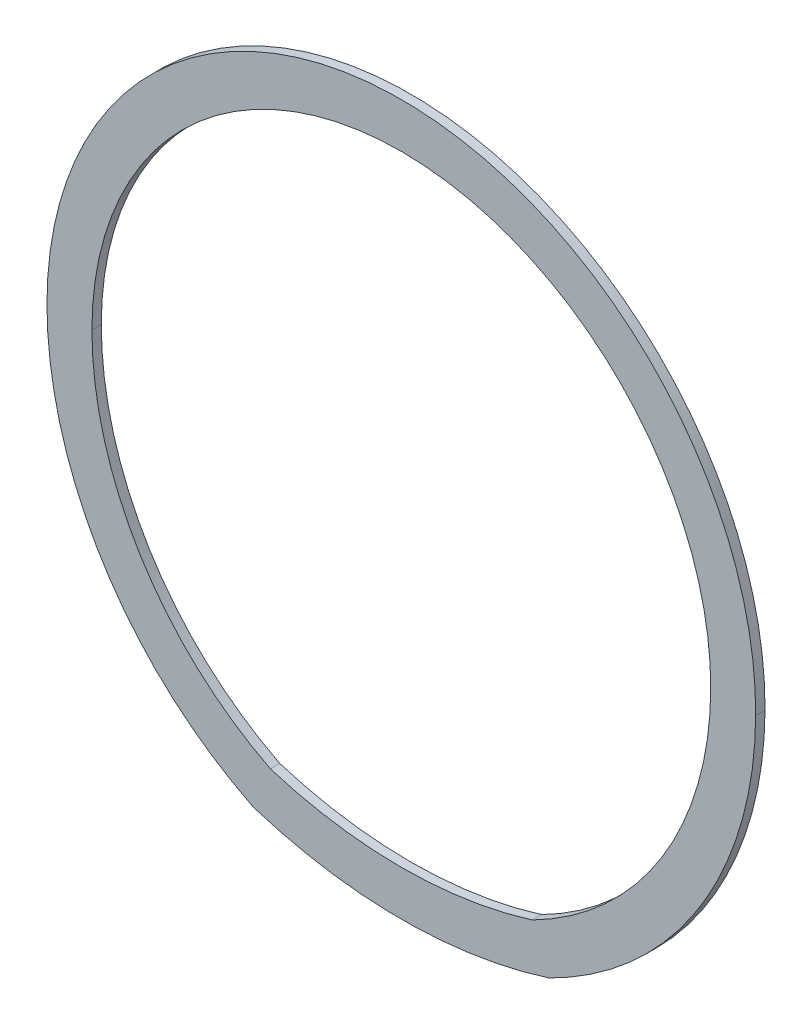
ISO-10303-21;
HEADER;
FILE_DESCRIPTION(('STEP AP214'),'2;1');
FILE_NAME('part.step','',(''),(''),'','','');
FILE_SCHEMA(('AUTOMOTIVE_DESIGN { 1 0 10303 214 1 1 1 1 }'));
ENDSEC;
DATA;
#1=APPLICATION_CONTEXT('core data for automotive mechanical design processes');
#2=APPLICATION_PROTOCOL_DEFINITION('international standard','automotive_design',2000,#1);
#3=PRODUCT_CONTEXT('',#1,'mechanical');
#4=PRODUCT('Part','Part','',(#3));
#5=PRODUCT_RELATED_PRODUCT_CATEGORY('part','',(#4));
#6=PRODUCT_DEFINITION_FORMATION('','',#4);
#7=PRODUCT_DEFINITION_CONTEXT('part definition',#1,'design');
#8=PRODUCT_DEFINITION('design','',#6,#7);
#9=PRODUCT_DEFINITION_SHAPE('','',#8);
#10=(LENGTH_UNIT() NAMED_UNIT(*) SI_UNIT(.MILLI.,.METRE.));
#11=(NAMED_UNIT(*) PLANE_ANGLE_UNIT() SI_UNIT($,.RADIAN.));
#12=(NAMED_UNIT(*) SI_UNIT($,.STERADIAN.) SOLID_ANGLE_UNIT());
#13=UNCERTAINTY_MEASURE_WITH_UNIT(LENGTH_MEASURE(1.E-05),#10,'distance_accuracy_value','');
#14=(GEOMETRIC_REPRESENTATION_CONTEXT(3) GLOBAL_UNCERTAINTY_ASSIGNED_CONTEXT((#13)) GLOBAL_UNIT_ASSIGNED_CONTEXT((#10,
#11,#12)) REPRESENTATION_CONTEXT('',''));
#15=CARTESIAN_POINT('',(0.,0.,0.));
#16=DIRECTION('',(0.,0.,1.));
#17=DIRECTION('',(1.,0.,0.));
#18=AXIS2_PLACEMENT_3D('',#15,#16,#17);
#19=CARTESIAN_POINT('',(2.87745258300709,41.275,1.5875));
#20=DIRECTION('',(0.,0.,1.));
#21=DIRECTION('',(1.,0.,0.));
#22=AXIS2_PLACEMENT_3D('',#19,#20,#21);
#23=PLANE('',#22);
#24=CARTESIAN_POINT('',(5.71473106786189,19.0500000000001,1.5875));
#25=DIRECTION('',(0.,0.,1.));
#26=DIRECTION('',(1.,0.,0.));
#27=AXIS2_PLACEMENT_3D('',#24,#25,#26);
#28=CIRCLE('',#27,125.813626794521);
#29=CARTESIAN_POINT('',(-120.098895726659,19.05,1.5875));
#30=VERTEX_POINT('',#29);
#31=CARTESIAN_POINT('',(-50.0584032460589,-93.7259999999829,1.5875));
#32=VERTEX_POINT('',#31);
#33=EDGE_CURVE('E135',#30,#32,#28,.T.);
#34=ORIENTED_EDGE('',*,*,#33,.T.);
#35=CARTESIAN_POINT('',(0.0401740981522854,63.5,1.5875));
#36=DIRECTION('',(0.,0.,1.));
#37=DIRECTION('',(1.,0.,0.));
#38=AXIS2_PLACEMENT_3D('',#35,#36,#37);
#39=CIRCLE('',#38,165.014794875819);
#40=CARTESIAN_POINT('',(50.138751442251,-93.726,1.5875));
#41=VERTEX_POINT('',#40);
#42=EDGE_CURVE('E138',#32,#41,#39,.T.);
#43=ORIENTED_EDGE('',*,*,#42,.T.);
#44=CARTESIAN_POINT('',(-5.64062361813422,19.0834910459425,1.5875));
#45=DIRECTION('',(0.,0.,1.));
#46=DIRECTION('',(-1.,0.,0.));
#47=AXIS2_PLACEMENT_3D('',#44,#45,#46);
#48=CIRCLE('',#47,125.846414141094);
#49=CARTESIAN_POINT('',(120.203613721784,18.3433015446214,1.5875));
#50=VERTEX_POINT('',#49);
#51=EDGE_CURVE('E141',#41,#50,#48,.T.);
#52=ORIENTED_EDGE('',*,*,#51,.T.);
#53=CARTESIAN_POINT('',(0.0533981517267298,19.05,1.5875));
#54=DIRECTION('',(0.,0.,1.));
#55=DIRECTION('',(-1.,0.,0.));
#56=AXIS2_PLACEMENT_3D('',#53,#54,#55);
#57=CIRCLE('',#56,120.152293878386);
#58=EDGE_CURVE('E143',#50,#30,#57,.T.);
#59=ORIENTED_EDGE('',*,*,#58,.T.);
#60=EDGE_LOOP('',(#34,#43,#52,#59));
#61=FACE_BOUND('',#60,.T.);
#62=CARTESIAN_POINT('',(0.0401740981522854,63.5,1.5875));
#63=DIRECTION('',(0.,0.,1.));
#64=DIRECTION('',(1.,0.,0.));
#65=AXIS2_PLACEMENT_3D('',#62,#63,#64);
#66=CIRCLE('',#65,149.774794875837);
#67=CARTESIAN_POINT('',(-44.3239593744346,-79.5535313836238,1.5875));
#68=VERTEX_POINT('',#67);
#69=CARTESIAN_POINT('',(44.4048605696805,-79.5533598849547,1.5875));
#70=VERTEX_POINT('',#69);
#71=EDGE_CURVE('E107',#68,#70,#66,.T.);
#72=ORIENTED_EDGE('',*,*,#71,.F.);
#73=CARTESIAN_POINT('',(5.71473106786189,19.0500000000001,1.5875));
#74=DIRECTION('',(0.,0.,1.));
#75=DIRECTION('',(1.,0.,0.));
#76=AXIS2_PLACEMENT_3D('',#73,#74,#75);
#77=CIRCLE('',#76,110.573626794554);
#78=CARTESIAN_POINT('',(-104.858895726692,19.05,1.5875));
#79=VERTEX_POINT('',#78);
#80=EDGE_CURVE('E99',#79,#68,#77,.T.);
#81=ORIENTED_EDGE('',*,*,#80,.F.);
#82=CARTESIAN_POINT('',(0.0533981517267298,19.05,1.5875));
#83=DIRECTION('',(0.,0.,1.));
#84=DIRECTION('',(-1.,0.,0.));
#85=AXIS2_PLACEMENT_3D('',#82,#83,#84);
#86=CIRCLE('',#85,104.912293878419);
#87=CARTESIAN_POINT('',(104.963877332422,18.4329384888053,1.5875));
#88=VERTEX_POINT('',#87);
#89=EDGE_CURVE('E121',#88,#79,#86,.T.);
#90=ORIENTED_EDGE('',*,*,#89,.F.);
#91=CARTESIAN_POINT('',(-5.64062361813422,19.0834910459425,1.5875));
#92=DIRECTION('',(0.,0.,1.));
#93=DIRECTION('',(-1.,0.,0.));
#94=AXIS2_PLACEMENT_3D('',#91,#92,#93);
#95=CIRCLE('',#94,110.60641414112);
#96=EDGE_CURVE('E119',#70,#88,#95,.T.);
#97=ORIENTED_EDGE('',*,*,#96,.F.);
#98=EDGE_LOOP('',(#72,#81,#90,#97));
#99=FACE_BOUND('',#98,.T.);
#100=ADVANCED_FACE('F34',(#61,#99),#23,.T.);
#101=CARTESIAN_POINT('',(2.87745258300709,41.275,-1.5875));
#102=DIRECTION('',(0.,0.,1.));
#103=DIRECTION('',(1.,0.,0.));
#104=AXIS2_PLACEMENT_3D('',#101,#102,#103);
#105=PLANE('',#104);
#106=CARTESIAN_POINT('',(5.71473106786189,19.0500000000001,-1.5875));
#107=DIRECTION('',(0.,0.,1.));
#108=DIRECTION('',(1.,0.,0.));
#109=AXIS2_PLACEMENT_3D('',#106,#107,#108);
#110=CIRCLE('',#109,125.813626794521);
#111=CARTESIAN_POINT('',(-120.098895726659,19.05,-1.5875));
#112=VERTEX_POINT('',#111);
#113=CARTESIAN_POINT('',(-50.0584032460589,-93.7259999999829,-1.5875));
#114=VERTEX_POINT('',#113);
#115=EDGE_CURVE('E115',#112,#114,#110,.T.);
#116=ORIENTED_EDGE('',*,*,#115,.F.);
#117=CARTESIAN_POINT('',(0.0533981517267298,19.05,-1.5875));
#118=DIRECTION('',(0.,0.,1.));
#119=DIRECTION('',(-1.,0.,0.));
#120=AXIS2_PLACEMENT_3D('',#117,#118,#119);
#121=CIRCLE('',#120,120.152293878386);
#122=CARTESIAN_POINT('',(120.203613721784,18.3433015446214,-1.5875));
#123=VERTEX_POINT('',#122);
#124=EDGE_CURVE('E139',#123,#112,#121,.T.);
#125=ORIENTED_EDGE('',*,*,#124,.F.);
#126=CARTESIAN_POINT('',(-5.64062361813422,19.0834910459425,-1.5875));
#127=DIRECTION('',(0.,0.,1.));
#128=DIRECTION('',(-1.,0.,0.));
#129=AXIS2_PLACEMENT_3D('',#126,#127,#128);
#130=CIRCLE('',#129,125.846414141094);
#131=CARTESIAN_POINT('',(50.138751442251,-93.726,-1.5875));
#132=VERTEX_POINT('',#131);
#133=EDGE_CURVE('E150',#132,#123,#130,.T.);
#134=ORIENTED_EDGE('',*,*,#133,.F.);
#135=CARTESIAN_POINT('',(0.0401740981522854,63.5,-1.5875));
#136=DIRECTION('',(0.,0.,1.));
#137=DIRECTION('',(1.,0.,0.));
#138=AXIS2_PLACEMENT_3D('',#135,#136,#137);
#139=CIRCLE('',#138,165.014794875819);
#140=EDGE_CURVE('E148',#114,#132,#139,.T.);
#141=ORIENTED_EDGE('',*,*,#140,.F.);
#142=EDGE_LOOP('',(#116,#125,#134,#141));
#143=FACE_BOUND('',#142,.T.);
#144=CARTESIAN_POINT('',(5.71473106786189,19.0500000000001,-1.5875));
#145=DIRECTION('',(0.,0.,1.));
#146=DIRECTION('',(1.,0.,0.));
#147=AXIS2_PLACEMENT_3D('',#144,#145,#146);
#148=CIRCLE('',#147,110.573626794554);
#149=CARTESIAN_POINT('',(-104.858895726692,19.05,-1.5875));
#150=VERTEX_POINT('',#149);
#151=CARTESIAN_POINT('',(-44.3239593744346,-79.5535313836238,-1.5875));
#152=VERTEX_POINT('',#151);
#153=EDGE_CURVE('E57',#150,#152,#148,.T.);
#154=ORIENTED_EDGE('',*,*,#153,.T.);
#155=CARTESIAN_POINT('',(0.0401740981522854,63.5,-1.5875));
#156=DIRECTION('',(0.,0.,1.));
#157=DIRECTION('',(1.,0.,0.));
#158=AXIS2_PLACEMENT_3D('',#155,#156,#157);
#159=CIRCLE('',#158,149.774794875837);
#160=CARTESIAN_POINT('',(44.4048605696805,-79.5533598849547,-1.5875));
#161=VERTEX_POINT('',#160);
#162=EDGE_CURVE('E114',#152,#161,#159,.T.);
#163=ORIENTED_EDGE('',*,*,#162,.T.);
#164=CARTESIAN_POINT('',(-5.64062361813422,19.0834910459425,-1.5875));
#165=DIRECTION('',(0.,0.,1.));
#166=DIRECTION('',(-1.,0.,0.));
#167=AXIS2_PLACEMENT_3D('',#164,#165,#166);
#168=CIRCLE('',#167,110.60641414112);
#169=CARTESIAN_POINT('',(104.963877332422,18.4329384888053,-1.5875));
#170=VERTEX_POINT('',#169);
#171=EDGE_CURVE('E127',#161,#170,#168,.T.);
#172=ORIENTED_EDGE('',*,*,#171,.T.);
#173=CARTESIAN_POINT('',(0.0533981517267298,19.05,-1.5875));
#174=DIRECTION('',(0.,0.,1.));
#175=DIRECTION('',(-1.,0.,0.));
#176=AXIS2_PLACEMENT_3D('',#173,#174,#175);
#177=CIRCLE('',#176,104.912293878419);
#178=EDGE_CURVE('E108',#170,#150,#177,.T.);
#179=ORIENTED_EDGE('',*,*,#178,.T.);
#180=EDGE_LOOP('',(#154,#163,#172,#179));
#181=FACE_BOUND('',#180,.T.);
#182=ADVANCED_FACE('F168',(#143,#181),#105,.F.);
#183=CARTESIAN_POINT('',(5.71473106786189,19.0500000000001,1.5875));
#184=DIRECTION('',(0.,0.,-1.));
#185=DIRECTION('',(-1.,0.,0.));
#186=AXIS2_PLACEMENT_3D('',#183,#184,#185);
#187=CYLINDRICAL_SURFACE('',#186,125.813626794521);
#188=ORIENTED_EDGE('',*,*,#115,.T.);
#189=DIRECTION('',(0.,0.,-1.));
#190=VECTOR('',#189,1.);
#191=CARTESIAN_POINT('',(-50.0584032460589,-93.7259999999829,1.5875));
#192=LINE('',#191,#190);
#193=EDGE_CURVE('E11',#32,#114,#192,.T.);
#194=ORIENTED_EDGE('',*,*,#193,.F.);
#195=ORIENTED_EDGE('',*,*,#33,.F.);
#196=DIRECTION('',(0.,0.,-1.));
#197=VECTOR('',#196,1.);
#198=CARTESIAN_POINT('',(-120.098895726659,19.05,1.5875));
#199=LINE('',#198,#197);
#200=EDGE_CURVE('E145',#30,#112,#199,.T.);
#201=ORIENTED_EDGE('',*,*,#200,.T.);
#202=EDGE_LOOP('',(#188,#194,#195,#201));
#203=FACE_BOUND('',#202,.T.);
#204=ADVANCED_FACE('F36',(#203),#187,.T.);
#205=CARTESIAN_POINT('',(0.0401740981522854,63.5,1.5875));
#206=DIRECTION('',(0.,0.,-1.));
#207=DIRECTION('',(-1.,0.,0.));
#208=AXIS2_PLACEMENT_3D('',#205,#206,#207);
#209=CYLINDRICAL_SURFACE('',#208,165.014794875819);
#210=ORIENTED_EDGE('',*,*,#140,.T.);
#211=DIRECTION('',(0.,0.,-1.));
#212=VECTOR('',#211,1.);
#213=CARTESIAN_POINT('',(50.138751442251,-93.726,1.5875));
#214=LINE('',#213,#212);
#215=EDGE_CURVE('E42',#41,#132,#214,.T.);
#216=ORIENTED_EDGE('',*,*,#215,.F.);
#217=ORIENTED_EDGE('',*,*,#42,.F.);
#218=ORIENTED_EDGE('',*,*,#193,.T.);
#219=EDGE_LOOP('',(#210,#216,#217,#218));
#220=FACE_BOUND('',#219,.T.);
#221=ADVANCED_FACE('F178',(#220),#209,.T.);
#222=CARTESIAN_POINT('',(-5.64062361813422,19.0834910459425,1.5875));
#223=DIRECTION('',(0.,0.,-1.));
#224=DIRECTION('',(-1.,0.,0.));
#225=AXIS2_PLACEMENT_3D('',#222,#223,#224);
#226=CYLINDRICAL_SURFACE('',#225,125.846414141094);
#227=ORIENTED_EDGE('',*,*,#133,.T.);
#228=DIRECTION('',(0.,0.,-1.));
#229=VECTOR('',#228,1.);
#230=CARTESIAN_POINT('',(120.203613721784,18.3433015446214,1.5875));
#231=LINE('',#230,#229);
#232=EDGE_CURVE('E155',#50,#123,#231,.T.);
#233=ORIENTED_EDGE('',*,*,#232,.F.);
#234=ORIENTED_EDGE('',*,*,#51,.F.);
#235=ORIENTED_EDGE('',*,*,#215,.T.);
#236=EDGE_LOOP('',(#227,#233,#234,#235));
#237=FACE_BOUND('',#236,.T.);
#238=ADVANCED_FACE('F162',(#237),#226,.T.);
#239=CARTESIAN_POINT('',(0.0533981517267298,19.05,1.5875));
#240=DIRECTION('',(0.,0.,-1.));
#241=DIRECTION('',(-1.,0.,0.));
#242=AXIS2_PLACEMENT_3D('',#239,#240,#241);
#243=CYLINDRICAL_SURFACE('',#242,120.152293878386);
#244=ORIENTED_EDGE('',*,*,#124,.T.);
#245=ORIENTED_EDGE('',*,*,#200,.F.);
#246=ORIENTED_EDGE('',*,*,#58,.F.);
#247=ORIENTED_EDGE('',*,*,#232,.T.);
#248=EDGE_LOOP('',(#244,#245,#246,#247));
#249=FACE_BOUND('',#248,.T.);
#250=ADVANCED_FACE('F172',(#249),#243,.T.);
#251=CARTESIAN_POINT('',(5.71473106786189,19.0500000000001,1.5875));
#252=DIRECTION('',(0.,0.,-1.));
#253=DIRECTION('',(-1.,0.,0.));
#254=AXIS2_PLACEMENT_3D('',#251,#252,#253);
#255=CYLINDRICAL_SURFACE('',#254,110.573626794554);
#256=ORIENTED_EDGE('',*,*,#153,.F.);
#257=DIRECTION('',(0.,0.,-1.));
#258=VECTOR('',#257,1.);
#259=CARTESIAN_POINT('',(-104.858895726692,19.05,1.5875));
#260=LINE('',#259,#258);
#261=EDGE_CURVE('E103',#79,#150,#260,.T.);
#262=ORIENTED_EDGE('',*,*,#261,.F.);
#263=ORIENTED_EDGE('',*,*,#80,.T.);
#264=DIRECTION('',(0.,0.,-1.));
#265=VECTOR('',#264,1.);
#266=CARTESIAN_POINT('',(-44.3239593744346,-79.5535313836238,1.5875));
#267=LINE('',#266,#265);
#268=EDGE_CURVE('E102',#68,#152,#267,.T.);
#269=ORIENTED_EDGE('',*,*,#268,.T.);
#270=EDGE_LOOP('',(#256,#262,#263,#269));
#271=FACE_BOUND('',#270,.T.);
#272=ADVANCED_FACE('F101',(#271),#255,.F.);
#273=CARTESIAN_POINT('',(0.0401740981522854,63.5,1.5875));
#274=DIRECTION('',(0.,0.,-1.));
#275=DIRECTION('',(-1.,0.,0.));
#276=AXIS2_PLACEMENT_3D('',#273,#274,#275);
#277=CYLINDRICAL_SURFACE('',#276,149.774794875837);
#278=ORIENTED_EDGE('',*,*,#162,.F.);
#279=ORIENTED_EDGE('',*,*,#268,.F.);
#280=ORIENTED_EDGE('',*,*,#71,.T.);
#281=DIRECTION('',(0.,0.,-1.));
#282=VECTOR('',#281,1.);
#283=CARTESIAN_POINT('',(44.4048605696805,-79.5533598849547,1.5875));
#284=LINE('',#283,#282);
#285=EDGE_CURVE('E116',#70,#161,#284,.T.);
#286=ORIENTED_EDGE('',*,*,#285,.T.);
#287=EDGE_LOOP('',(#278,#279,#280,#286));
#288=FACE_BOUND('',#287,.T.);
#289=ADVANCED_FACE('F111',(#288),#277,.F.);
#290=CARTESIAN_POINT('',(-5.64062361813422,19.0834910459425,1.5875));
#291=DIRECTION('',(0.,0.,-1.));
#292=DIRECTION('',(-1.,0.,0.));
#293=AXIS2_PLACEMENT_3D('',#290,#291,#292);
#294=CYLINDRICAL_SURFACE('',#293,110.60641414112);
#295=ORIENTED_EDGE('',*,*,#171,.F.);
#296=ORIENTED_EDGE('',*,*,#285,.F.);
#297=ORIENTED_EDGE('',*,*,#96,.T.);
#298=DIRECTION('',(0.,0.,-1.));
#299=VECTOR('',#298,1.);
#300=CARTESIAN_POINT('',(104.963877332422,18.4329384888053,1.5875));
#301=LINE('',#300,#299);
#302=EDGE_CURVE('E49',#88,#170,#301,.T.);
#303=ORIENTED_EDGE('',*,*,#302,.T.);
#304=EDGE_LOOP('',(#295,#296,#297,#303));
#305=FACE_BOUND('',#304,.T.);
#306=ADVANCED_FACE('F201',(#305),#294,.F.);
#307=CARTESIAN_POINT('',(0.0533981517267298,19.05,1.5875));
#308=DIRECTION('',(0.,0.,-1.));
#309=DIRECTION('',(-1.,0.,0.));
#310=AXIS2_PLACEMENT_3D('',#307,#308,#309);
#311=CYLINDRICAL_SURFACE('',#310,104.912293878419);
#312=ORIENTED_EDGE('',*,*,#178,.F.);
#313=ORIENTED_EDGE('',*,*,#302,.F.);
#314=ORIENTED_EDGE('',*,*,#89,.T.);
#315=ORIENTED_EDGE('',*,*,#261,.T.);
#316=EDGE_LOOP('',(#312,#313,#314,#315));
#317=FACE_BOUND('',#316,.T.);
#318=ADVANCED_FACE('F205',(#317),#311,.F.);
#319=CLOSED_SHELL('',(#100,#182,#204,#221,#238,#250,#272,#289,#306,#318));
#320=MANIFOLD_SOLID_BREP('B2',#319);
#321=ADVANCED_BREP_SHAPE_REPRESENTATION('',(#18,#320),#14);
#322=SHAPE_DEFINITION_REPRESENTATION(#9,#321);
ENDSEC;
END-ISO-10303-21;
